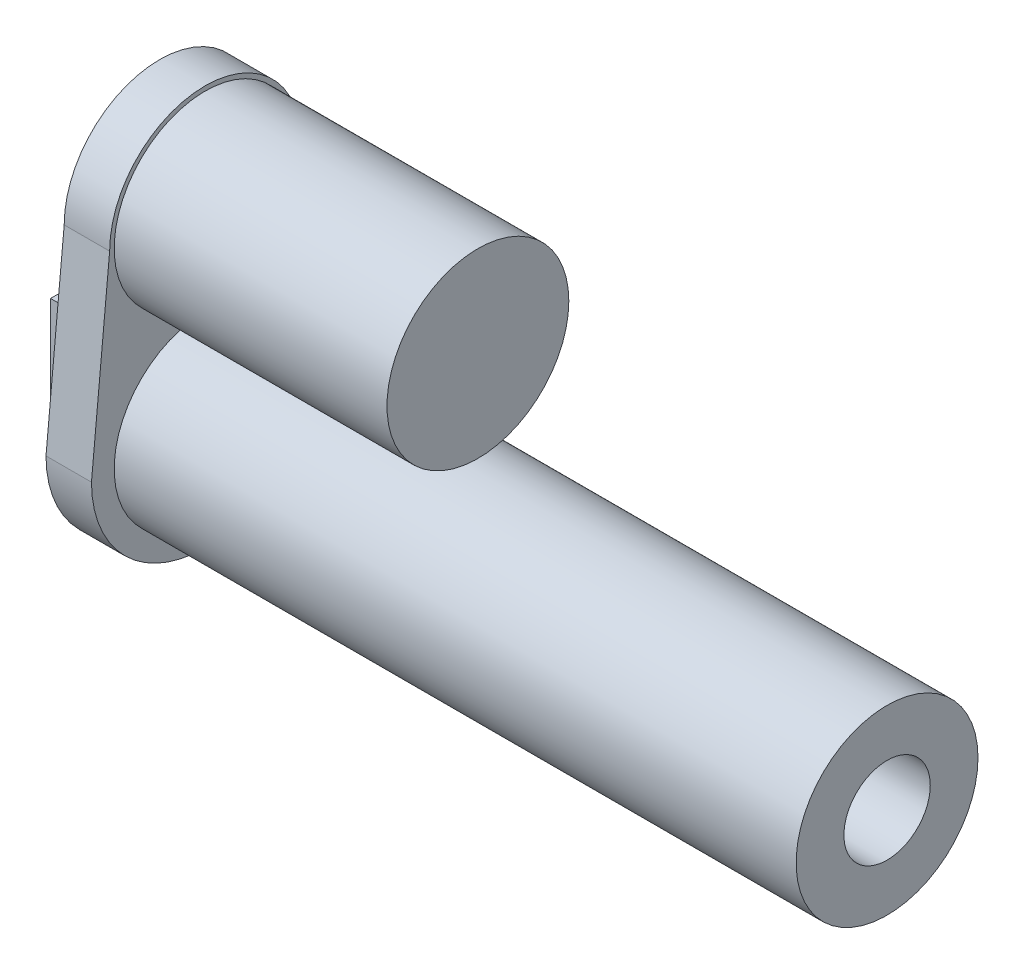
ISO-10303-21;
HEADER;
FILE_DESCRIPTION(('STEP AP214'),'2;1');
FILE_NAME('part.step','',(''),(''),'','','');
FILE_SCHEMA(('AUTOMOTIVE_DESIGN { 1 0 10303 214 1 1 1 1 }'));
ENDSEC;
DATA;
#1=APPLICATION_CONTEXT('core data for automotive mechanical design processes');
#2=APPLICATION_PROTOCOL_DEFINITION('international standard','automotive_design',2000,#1);
#3=PRODUCT_CONTEXT('',#1,'mechanical');
#4=PRODUCT('Part','Part','',(#3));
#5=PRODUCT_RELATED_PRODUCT_CATEGORY('part','',(#4));
#6=PRODUCT_DEFINITION_FORMATION('','',#4);
#7=PRODUCT_DEFINITION_CONTEXT('part definition',#1,'design');
#8=PRODUCT_DEFINITION('design','',#6,#7);
#9=PRODUCT_DEFINITION_SHAPE('','',#8);
#10=(LENGTH_UNIT() NAMED_UNIT(*) SI_UNIT(.MILLI.,.METRE.));
#11=(NAMED_UNIT(*) PLANE_ANGLE_UNIT() SI_UNIT($,.RADIAN.));
#12=(NAMED_UNIT(*) SI_UNIT($,.STERADIAN.) SOLID_ANGLE_UNIT());
#13=UNCERTAINTY_MEASURE_WITH_UNIT(LENGTH_MEASURE(1.E-05),#10,'distance_accuracy_value','');
#14=(GEOMETRIC_REPRESENTATION_CONTEXT(3) GLOBAL_UNCERTAINTY_ASSIGNED_CONTEXT((#13)) GLOBAL_UNIT_ASSIGNED_CONTEXT((#10,
#11,#12)) REPRESENTATION_CONTEXT('',''));
#15=CARTESIAN_POINT('',(0.,0.,0.));
#16=DIRECTION('',(0.,0.,1.));
#17=DIRECTION('',(1.,0.,0.));
#18=AXIS2_PLACEMENT_3D('',#15,#16,#17);
#19=CARTESIAN_POINT('',(0.,42.,0.));
#20=DIRECTION('',(1.,0.,0.));
#21=DIRECTION('',(0.,0.,-1.));
#22=AXIS2_PLACEMENT_3D('',#19,#20,#21);
#23=PLANE('',#22);
#24=CARTESIAN_POINT('',(0.,42.,0.));
#25=DIRECTION('',(1.,0.,0.));
#26=DIRECTION('',(0.,0.,-1.));
#27=AXIS2_PLACEMENT_3D('',#24,#25,#26);
#28=CIRCLE('',#27,21.);
#29=CARTESIAN_POINT('',(0.,42.,-21.));
#30=VERTEX_POINT('',#29);
#31=CARTESIAN_POINT('',(0.,42.,21.));
#32=VERTEX_POINT('',#31);
#33=EDGE_CURVE('E120',#30,#32,#28,.T.);
#34=ORIENTED_EDGE('',*,*,#33,.F.);
#35=DIRECTION('',(0.,0.995495472593952,0.0948090926279954));
#36=VECTOR('',#35,1.);
#37=CARTESIAN_POINT('',(0.,42.,-21.));
#38=LINE('',#37,#36);
#39=CARTESIAN_POINT('',(0.,0.,-25.));
#40=VERTEX_POINT('',#39);
#41=EDGE_CURVE('E147',#40,#30,#38,.T.);
#42=ORIENTED_EDGE('',*,*,#41,.F.);
#43=CARTESIAN_POINT('',(0.,0.,0.));
#44=DIRECTION('',(1.,0.,0.));
#45=DIRECTION('',(0.,0.,1.));
#46=AXIS2_PLACEMENT_3D('',#43,#44,#45);
#47=CIRCLE('',#46,25.);
#48=CARTESIAN_POINT('',(0.,0.,25.));
#49=VERTEX_POINT('',#48);
#50=EDGE_CURVE('E158',#49,#40,#47,.T.);
#51=ORIENTED_EDGE('',*,*,#50,.F.);
#52=DIRECTION('',(0.,-0.995495472593952,0.0948090926279954));
#53=VECTOR('',#52,1.);
#54=CARTESIAN_POINT('',(0.,42.,21.));
#55=LINE('',#54,#53);
#56=EDGE_CURVE('E156',#32,#49,#55,.T.);
#57=ORIENTED_EDGE('',*,*,#56,.F.);
#58=EDGE_LOOP('',(#34,#42,#51,#57));
#59=FACE_BOUND('',#58,.T.);
#60=DIRECTION('',(0.,0.,-1.));
#61=VECTOR('',#60,1.);
#62=CARTESIAN_POINT('',(0.,9.5,0.));
#63=LINE('',#62,#61);
#64=CARTESIAN_POINT('',(0.,9.5,4.));
#65=VERTEX_POINT('',#64);
#66=CARTESIAN_POINT('',(0.,9.5,-4.));
#67=VERTEX_POINT('',#66);
#68=EDGE_CURVE('E118',#65,#67,#63,.T.);
#69=ORIENTED_EDGE('',*,*,#68,.F.);
#70=DIRECTION('',(0.,1.,0.));
#71=VECTOR('',#70,1.);
#72=CARTESIAN_POINT('',(0.,-9.5,4.));
#73=LINE('',#72,#71);
#74=CARTESIAN_POINT('',(0.,-9.5,4.));
#75=VERTEX_POINT('',#74);
#76=EDGE_CURVE('E113',#75,#65,#73,.T.);
#77=ORIENTED_EDGE('',*,*,#76,.F.);
#78=DIRECTION('',(0.,0.,1.));
#79=VECTOR('',#78,1.);
#80=CARTESIAN_POINT('',(0.,-9.5,-4.));
#81=LINE('',#80,#79);
#82=CARTESIAN_POINT('',(0.,-9.5,-4.));
#83=VERTEX_POINT('',#82);
#84=EDGE_CURVE('E60',#83,#75,#81,.T.);
#85=ORIENTED_EDGE('',*,*,#84,.F.);
#86=DIRECTION('',(0.,-1.,0.));
#87=VECTOR('',#86,1.);
#88=CARTESIAN_POINT('',(0.,9.5,-4.));
#89=LINE('',#88,#87);
#90=EDGE_CURVE('E55',#67,#83,#89,.T.);
#91=ORIENTED_EDGE('',*,*,#90,.F.);
#92=EDGE_LOOP('',(#69,#77,#85,#91));
#93=FACE_BOUND('',#92,.T.);
#94=ADVANCED_FACE('F39',(#59,#93),#23,.F.);
#95=CARTESIAN_POINT('',(10.,42.,0.));
#96=DIRECTION('',(-1.,0.,0.));
#97=DIRECTION('',(0.,0.,1.));
#98=AXIS2_PLACEMENT_3D('',#95,#96,#97);
#99=CYLINDRICAL_SURFACE('',#98,21.);
#100=ORIENTED_EDGE('',*,*,#33,.T.);
#101=DIRECTION('',(-1.,0.,0.));
#102=VECTOR('',#101,1.);
#103=CARTESIAN_POINT('',(10.,42.,21.));
#104=LINE('',#103,#102);
#105=CARTESIAN_POINT('',(10.,42.,21.));
#106=VERTEX_POINT('',#105);
#107=EDGE_CURVE('E11',#106,#32,#104,.T.);
#108=ORIENTED_EDGE('',*,*,#107,.F.);
#109=CARTESIAN_POINT('',(10.,42.,0.));
#110=DIRECTION('',(1.,0.,0.));
#111=DIRECTION('',(0.,0.,-1.));
#112=AXIS2_PLACEMENT_3D('',#109,#110,#111);
#113=CIRCLE('',#112,21.);
#114=CARTESIAN_POINT('',(10.,42.,-21.));
#115=VERTEX_POINT('',#114);
#116=EDGE_CURVE('E143',#115,#106,#113,.T.);
#117=ORIENTED_EDGE('',*,*,#116,.F.);
#118=DIRECTION('',(-1.,0.,0.));
#119=VECTOR('',#118,1.);
#120=CARTESIAN_POINT('',(10.,42.,-21.));
#121=LINE('',#120,#119);
#122=EDGE_CURVE('E153',#115,#30,#121,.T.);
#123=ORIENTED_EDGE('',*,*,#122,.T.);
#124=EDGE_LOOP('',(#100,#108,#117,#123));
#125=FACE_BOUND('',#124,.T.);
#126=ADVANCED_FACE('F41',(#125),#99,.T.);
#127=CARTESIAN_POINT('',(10.,42.,21.));
#128=DIRECTION('',(0.,-0.0948090926279954,-0.995495472593952));
#129=DIRECTION('',(0.,0.995495472593952,-0.0948090926279954));
#130=AXIS2_PLACEMENT_3D('',#127,#128,#129);
#131=PLANE('',#130);
#132=ORIENTED_EDGE('',*,*,#56,.T.);
#133=DIRECTION('',(-1.,0.,0.));
#134=VECTOR('',#133,1.);
#135=CARTESIAN_POINT('',(10.,0.,25.));
#136=LINE('',#135,#134);
#137=CARTESIAN_POINT('',(10.,0.,25.));
#138=VERTEX_POINT('',#137);
#139=EDGE_CURVE('E48',#138,#49,#136,.T.);
#140=ORIENTED_EDGE('',*,*,#139,.F.);
#141=DIRECTION('',(0.,-0.995495472593952,0.0948090926279954));
#142=VECTOR('',#141,1.);
#143=CARTESIAN_POINT('',(10.,42.,21.));
#144=LINE('',#143,#142);
#145=EDGE_CURVE('E146',#106,#138,#144,.T.);
#146=ORIENTED_EDGE('',*,*,#145,.F.);
#147=ORIENTED_EDGE('',*,*,#107,.T.);
#148=EDGE_LOOP('',(#132,#140,#146,#147));
#149=FACE_BOUND('',#148,.T.);
#150=ADVANCED_FACE('F186',(#149),#131,.F.);
#151=CARTESIAN_POINT('',(10.,0.,0.));
#152=DIRECTION('',(-1.,0.,0.));
#153=DIRECTION('',(0.,0.,1.));
#154=AXIS2_PLACEMENT_3D('',#151,#152,#153);
#155=CYLINDRICAL_SURFACE('',#154,25.);
#156=ORIENTED_EDGE('',*,*,#50,.T.);
#157=DIRECTION('',(-1.,0.,0.));
#158=VECTOR('',#157,1.);
#159=CARTESIAN_POINT('',(10.,0.,-25.));
#160=LINE('',#159,#158);
#161=CARTESIAN_POINT('',(10.,0.,-25.));
#162=VERTEX_POINT('',#161);
#163=EDGE_CURVE('E163',#162,#40,#160,.T.);
#164=ORIENTED_EDGE('',*,*,#163,.F.);
#165=CARTESIAN_POINT('',(10.,0.,0.));
#166=DIRECTION('',(1.,0.,0.));
#167=DIRECTION('',(0.,0.,1.));
#168=AXIS2_PLACEMENT_3D('',#165,#166,#167);
#169=CIRCLE('',#168,25.);
#170=EDGE_CURVE('E149',#138,#162,#169,.T.);
#171=ORIENTED_EDGE('',*,*,#170,.F.);
#172=ORIENTED_EDGE('',*,*,#139,.T.);
#173=EDGE_LOOP('',(#156,#164,#171,#172));
#174=FACE_BOUND('',#173,.T.);
#175=ADVANCED_FACE('F171',(#174),#155,.T.);
#176=CARTESIAN_POINT('',(10.,42.,-21.));
#177=DIRECTION('',(0.,-0.0948090926279954,0.995495472593952));
#178=DIRECTION('',(0.,-0.995495472593952,-0.0948090926279954));
#179=AXIS2_PLACEMENT_3D('',#176,#177,#178);
#180=PLANE('',#179);
#181=ORIENTED_EDGE('',*,*,#41,.T.);
#182=ORIENTED_EDGE('',*,*,#122,.F.);
#183=DIRECTION('',(0.,0.995495472593952,0.0948090926279954));
#184=VECTOR('',#183,1.);
#185=CARTESIAN_POINT('',(10.,42.,-21.));
#186=LINE('',#185,#184);
#187=EDGE_CURVE('E151',#162,#115,#186,.T.);
#188=ORIENTED_EDGE('',*,*,#187,.F.);
#189=ORIENTED_EDGE('',*,*,#163,.T.);
#190=EDGE_LOOP('',(#181,#182,#188,#189));
#191=FACE_BOUND('',#190,.T.);
#192=ADVANCED_FACE('F179',(#191),#180,.F.);
#193=CARTESIAN_POINT('',(10.,42.,0.));
#194=DIRECTION('',(1.,0.,0.));
#195=DIRECTION('',(0.,0.,-1.));
#196=AXIS2_PLACEMENT_3D('',#193,#194,#195);
#197=PLANE('',#196);
#198=CARTESIAN_POINT('',(10.,41.9999999999999,0.));
#199=DIRECTION('',(1.,0.,0.));
#200=DIRECTION('',(0.,0.,-1.));
#201=AXIS2_PLACEMENT_3D('',#198,#199,#200);
#202=CIRCLE('',#201,20.);
#203=CARTESIAN_POINT('',(10.,41.9999999999999,-20.));
#204=VERTEX_POINT('',#203);
#205=EDGE_CURVE('E211',#204,#204,#202,.T.);
#206=ORIENTED_EDGE('',*,*,#205,.F.);
#207=EDGE_LOOP('',(#206));
#208=FACE_BOUND('',#207,.T.);
#209=CARTESIAN_POINT('',(10.,0.,0.));
#210=DIRECTION('',(1.,0.,0.));
#211=DIRECTION('',(0.,0.,-1.));
#212=AXIS2_PLACEMENT_3D('',#209,#210,#211);
#213=CIRCLE('',#212,20.);
#214=CARTESIAN_POINT('',(10.,0.,-20.));
#215=VERTEX_POINT('',#214);
#216=EDGE_CURVE('E214',#215,#215,#213,.T.);
#217=ORIENTED_EDGE('',*,*,#216,.F.);
#218=EDGE_LOOP('',(#217));
#219=FACE_BOUND('',#218,.T.);
#220=ORIENTED_EDGE('',*,*,#116,.T.);
#221=ORIENTED_EDGE('',*,*,#145,.T.);
#222=ORIENTED_EDGE('',*,*,#170,.T.);
#223=ORIENTED_EDGE('',*,*,#187,.T.);
#224=EDGE_LOOP('',(#220,#221,#222,#223));
#225=FACE_BOUND('',#224,.T.);
#226=ADVANCED_FACE('F185',(#208,#219,#225),#197,.T.);
#227=CARTESIAN_POINT('',(-20.,9.5,0.));
#228=DIRECTION('',(0.,-1.,0.));
#229=DIRECTION('',(0.,0.,-1.));
#230=AXIS2_PLACEMENT_3D('',#227,#228,#229);
#231=PLANE('',#230);
#232=ORIENTED_EDGE('',*,*,#68,.T.);
#233=DIRECTION('',(1.,0.,0.));
#234=VECTOR('',#233,1.);
#235=CARTESIAN_POINT('',(-20.,9.5,-4.));
#236=LINE('',#235,#234);
#237=CARTESIAN_POINT('',(-20.,9.5,-4.));
#238=VERTEX_POINT('',#237);
#239=EDGE_CURVE('E116',#238,#67,#236,.T.);
#240=ORIENTED_EDGE('',*,*,#239,.F.);
#241=DIRECTION('',(0.,0.,-1.));
#242=VECTOR('',#241,1.);
#243=CARTESIAN_POINT('',(-20.,9.5,4.));
#244=LINE('',#243,#242);
#245=CARTESIAN_POINT('',(-20.,9.5,4.));
#246=VERTEX_POINT('',#245);
#247=EDGE_CURVE('E102',#246,#238,#244,.T.);
#248=ORIENTED_EDGE('',*,*,#247,.F.);
#249=DIRECTION('',(1.,0.,0.));
#250=VECTOR('',#249,1.);
#251=CARTESIAN_POINT('',(-20.,9.5,4.));
#252=LINE('',#251,#250);
#253=EDGE_CURVE('E132',#246,#65,#252,.T.);
#254=ORIENTED_EDGE('',*,*,#253,.T.);
#255=EDGE_LOOP('',(#232,#240,#248,#254));
#256=FACE_BOUND('',#255,.T.);
#257=ADVANCED_FACE('F117',(#256),#231,.F.);
#258=CARTESIAN_POINT('',(-20.,9.5,-4.));
#259=DIRECTION('',(0.,0.,1.));
#260=DIRECTION('',(0.,-1.,0.));
#261=AXIS2_PLACEMENT_3D('',#258,#259,#260);
#262=PLANE('',#261);
#263=CARTESIAN_POINT('',(-11.,0.,-4.));
#264=DIRECTION('',(0.,0.,-1.));
#265=DIRECTION('',(0.,1.,0.));
#266=AXIS2_PLACEMENT_3D('',#263,#264,#265);
#267=CIRCLE('',#266,4.5);
#268=CARTESIAN_POINT('',(-11.,4.5,-4.));
#269=VERTEX_POINT('',#268);
#270=EDGE_CURVE('E220',#269,#269,#267,.T.);
#271=ORIENTED_EDGE('',*,*,#270,.F.);
#272=EDGE_LOOP('',(#271));
#273=FACE_BOUND('',#272,.T.);
#274=ORIENTED_EDGE('',*,*,#90,.T.);
#275=DIRECTION('',(1.,0.,0.));
#276=VECTOR('',#275,1.);
#277=CARTESIAN_POINT('',(-20.,-9.5,-4.));
#278=LINE('',#277,#276);
#279=CARTESIAN_POINT('',(-20.,-9.5,-4.));
#280=VERTEX_POINT('',#279);
#281=EDGE_CURVE('E121',#280,#83,#278,.T.);
#282=ORIENTED_EDGE('',*,*,#281,.F.);
#283=DIRECTION('',(0.,-1.,0.));
#284=VECTOR('',#283,1.);
#285=CARTESIAN_POINT('',(-20.,9.5,-4.));
#286=LINE('',#285,#284);
#287=EDGE_CURVE('E106',#238,#280,#286,.T.);
#288=ORIENTED_EDGE('',*,*,#287,.F.);
#289=ORIENTED_EDGE('',*,*,#239,.T.);
#290=EDGE_LOOP('',(#274,#282,#288,#289));
#291=FACE_BOUND('',#290,.T.);
#292=ADVANCED_FACE('F123',(#273,#291),#262,.F.);
#293=CARTESIAN_POINT('',(-20.,-9.5,-4.));
#294=DIRECTION('',(0.,1.,0.));
#295=DIRECTION('',(0.,0.,1.));
#296=AXIS2_PLACEMENT_3D('',#293,#294,#295);
#297=PLANE('',#296);
#298=ORIENTED_EDGE('',*,*,#84,.T.);
#299=DIRECTION('',(1.,0.,0.));
#300=VECTOR('',#299,1.);
#301=CARTESIAN_POINT('',(-20.,-9.5,4.));
#302=LINE('',#301,#300);
#303=CARTESIAN_POINT('',(-20.,-9.5,4.));
#304=VERTEX_POINT('',#303);
#305=EDGE_CURVE('E139',#304,#75,#302,.T.);
#306=ORIENTED_EDGE('',*,*,#305,.F.);
#307=DIRECTION('',(0.,0.,1.));
#308=VECTOR('',#307,1.);
#309=CARTESIAN_POINT('',(-20.,-9.5,-4.));
#310=LINE('',#309,#308);
#311=EDGE_CURVE('E126',#280,#304,#310,.T.);
#312=ORIENTED_EDGE('',*,*,#311,.F.);
#313=ORIENTED_EDGE('',*,*,#281,.T.);
#314=EDGE_LOOP('',(#298,#306,#312,#313));
#315=FACE_BOUND('',#314,.T.);
#316=ADVANCED_FACE('F250',(#315),#297,.F.);
#317=CARTESIAN_POINT('',(-20.,-9.5,4.));
#318=DIRECTION('',(0.,0.,-1.));
#319=DIRECTION('',(-1.,0.,0.));
#320=AXIS2_PLACEMENT_3D('',#317,#318,#319);
#321=PLANE('',#320);
#322=CARTESIAN_POINT('',(-11.,0.,4.));
#323=DIRECTION('',(0.,0.,-1.));
#324=DIRECTION('',(-1.,0.,0.));
#325=AXIS2_PLACEMENT_3D('',#322,#323,#324);
#326=CIRCLE('',#325,4.5);
#327=CARTESIAN_POINT('',(-15.5,0.,4.));
#328=VERTEX_POINT('',#327);
#329=EDGE_CURVE('E43',#328,#328,#326,.T.);
#330=ORIENTED_EDGE('',*,*,#329,.T.);
#331=EDGE_LOOP('',(#330));
#332=FACE_BOUND('',#331,.T.);
#333=ORIENTED_EDGE('',*,*,#76,.T.);
#334=ORIENTED_EDGE('',*,*,#253,.F.);
#335=DIRECTION('',(0.,1.,0.));
#336=VECTOR('',#335,1.);
#337=CARTESIAN_POINT('',(-20.,-9.5,4.));
#338=LINE('',#337,#336);
#339=EDGE_CURVE('E109',#304,#246,#338,.T.);
#340=ORIENTED_EDGE('',*,*,#339,.F.);
#341=ORIENTED_EDGE('',*,*,#305,.T.);
#342=EDGE_LOOP('',(#333,#334,#340,#341));
#343=FACE_BOUND('',#342,.T.);
#344=ADVANCED_FACE('F231',(#332,#343),#321,.F.);
#345=CARTESIAN_POINT('',(-20.,0.,0.));
#346=DIRECTION('',(-1.,0.,0.));
#347=DIRECTION('',(0.,0.,1.));
#348=AXIS2_PLACEMENT_3D('',#345,#346,#347);
#349=PLANE('',#348);
#350=ORIENTED_EDGE('',*,*,#247,.T.);
#351=ORIENTED_EDGE('',*,*,#287,.T.);
#352=ORIENTED_EDGE('',*,*,#311,.T.);
#353=ORIENTED_EDGE('',*,*,#339,.T.);
#354=EDGE_LOOP('',(#350,#351,#352,#353));
#355=FACE_BOUND('',#354,.T.);
#356=ADVANCED_FACE('F104',(#355),#349,.T.);
#357=CARTESIAN_POINT('',(-11.,0.,25.));
#358=DIRECTION('',(0.,0.,-1.));
#359=DIRECTION('',(0.,1.,0.));
#360=AXIS2_PLACEMENT_3D('',#357,#358,#359);
#361=CYLINDRICAL_SURFACE('',#360,4.5);
#362=ORIENTED_EDGE('',*,*,#270,.T.);
#363=EDGE_LOOP('',(#362));
#364=FACE_BOUND('',#363,.T.);
#365=ORIENTED_EDGE('',*,*,#329,.F.);
#366=EDGE_LOOP('',(#365));
#367=FACE_BOUND('',#366,.T.);
#368=ADVANCED_FACE('F234',(#364,#367),#361,.F.);
#369=CARTESIAN_POINT('',(160.,0.,0.));
#370=DIRECTION('',(-1.,0.,0.));
#371=DIRECTION('',(0.,0.,1.));
#372=AXIS2_PLACEMENT_3D('',#369,#370,#371);
#373=CYLINDRICAL_SURFACE('',#372,20.);
#374=CARTESIAN_POINT('',(160.,0.,0.));
#375=DIRECTION('',(1.,0.,0.));
#376=DIRECTION('',(0.,0.,-1.));
#377=AXIS2_PLACEMENT_3D('',#374,#375,#376);
#378=CIRCLE('',#377,20.);
#379=CARTESIAN_POINT('',(160.,0.,-20.));
#380=VERTEX_POINT('',#379);
#381=EDGE_CURVE('E216',#380,#380,#378,.T.);
#382=ORIENTED_EDGE('',*,*,#381,.F.);
#383=EDGE_LOOP('',(#382));
#384=FACE_BOUND('',#383,.T.);
#385=ORIENTED_EDGE('',*,*,#216,.T.);
#386=EDGE_LOOP('',(#385));
#387=FACE_BOUND('',#386,.T.);
#388=ADVANCED_FACE('F236',(#384,#387),#373,.T.);
#389=CARTESIAN_POINT('',(160.,0.,0.));
#390=DIRECTION('',(1.,0.,0.));
#391=DIRECTION('',(0.,0.,-1.));
#392=AXIS2_PLACEMENT_3D('',#389,#390,#391);
#393=PLANE('',#392);
#394=CARTESIAN_POINT('',(160.,0.,0.));
#395=DIRECTION('',(1.,0.,0.));
#396=DIRECTION('',(0.,0.,-1.));
#397=AXIS2_PLACEMENT_3D('',#394,#395,#396);
#398=CIRCLE('',#397,9.5);
#399=CARTESIAN_POINT('',(160.,0.,-9.5));
#400=VERTEX_POINT('',#399);
#401=EDGE_CURVE('E401',#400,#400,#398,.T.);
#402=ORIENTED_EDGE('',*,*,#401,.F.);
#403=EDGE_LOOP('',(#402));
#404=FACE_BOUND('',#403,.T.);
#405=ORIENTED_EDGE('',*,*,#381,.T.);
#406=EDGE_LOOP('',(#405));
#407=FACE_BOUND('',#406,.T.);
#408=ADVANCED_FACE('F242',(#404,#407),#393,.T.);
#409=CARTESIAN_POINT('',(70.,41.9999999999999,0.));
#410=DIRECTION('',(-1.,0.,0.));
#411=DIRECTION('',(0.,0.,1.));
#412=AXIS2_PLACEMENT_3D('',#409,#410,#411);
#413=CYLINDRICAL_SURFACE('',#412,20.);
#414=CARTESIAN_POINT('',(70.,41.9999999999999,0.));
#415=DIRECTION('',(1.,0.,0.));
#416=DIRECTION('',(0.,0.,-1.));
#417=AXIS2_PLACEMENT_3D('',#414,#415,#416);
#418=CIRCLE('',#417,20.);
#419=CARTESIAN_POINT('',(70.,41.9999999999999,-20.));
#420=VERTEX_POINT('',#419);
#421=EDGE_CURVE('E217',#420,#420,#418,.T.);
#422=ORIENTED_EDGE('',*,*,#421,.F.);
#423=EDGE_LOOP('',(#422));
#424=FACE_BOUND('',#423,.T.);
#425=ORIENTED_EDGE('',*,*,#205,.T.);
#426=EDGE_LOOP('',(#425));
#427=FACE_BOUND('',#426,.T.);
#428=ADVANCED_FACE('F295',(#424,#427),#413,.T.);
#429=CARTESIAN_POINT('',(70.,0.,0.));
#430=DIRECTION('',(1.,0.,0.));
#431=DIRECTION('',(0.,0.,-1.));
#432=AXIS2_PLACEMENT_3D('',#429,#430,#431);
#433=PLANE('',#432);
#434=ORIENTED_EDGE('',*,*,#421,.T.);
#435=EDGE_LOOP('',(#434));
#436=FACE_BOUND('',#435,.T.);
#437=ADVANCED_FACE('F306',(#436),#433,.T.);
#438=CARTESIAN_POINT('',(10.,0.,0.));
#439=DIRECTION('',(1.,0.,0.));
#440=DIRECTION('',(0.,0.,-1.));
#441=AXIS2_PLACEMENT_3D('',#438,#439,#440);
#442=CYLINDRICAL_SURFACE('',#441,9.5);
#443=CARTESIAN_POINT('',(10.,0.,0.));
#444=DIRECTION('',(1.,0.,0.));
#445=DIRECTION('',(0.,0.,-1.));
#446=AXIS2_PLACEMENT_3D('',#443,#444,#445);
#447=CIRCLE('',#446,9.5);
#448=CARTESIAN_POINT('',(10.,0.,-9.5));
#449=VERTEX_POINT('',#448);
#450=EDGE_CURVE('E400',#449,#449,#447,.T.);
#451=ORIENTED_EDGE('',*,*,#450,.F.);
#452=EDGE_LOOP('',(#451));
#453=FACE_BOUND('',#452,.T.);
#454=ORIENTED_EDGE('',*,*,#401,.T.);
#455=EDGE_LOOP('',(#454));
#456=FACE_BOUND('',#455,.T.);
#457=ADVANCED_FACE('F315',(#453,#456),#442,.F.);
#458=CARTESIAN_POINT('',(10.,0.,0.));
#459=DIRECTION('',(1.,0.,0.));
#460=DIRECTION('',(0.,0.,-1.));
#461=AXIS2_PLACEMENT_3D('',#458,#459,#460);
#462=PLANE('',#461);
#463=ORIENTED_EDGE('',*,*,#450,.T.);
#464=EDGE_LOOP('',(#463));
#465=FACE_BOUND('',#464,.T.);
#466=ADVANCED_FACE('F327',(#465),#462,.T.);
#467=CLOSED_SHELL('',(#94,#126,#150,#175,#192,#226,#257,#292,#316,#344,#356,#368,#388,#408,#428,
#437,#457,#466));
#468=MANIFOLD_SOLID_BREP('B2',#467);
#469=ADVANCED_BREP_SHAPE_REPRESENTATION('',(#18,#468),#14);
#470=SHAPE_DEFINITION_REPRESENTATION(#9,#469);
ENDSEC;
END-ISO-10303-21;
